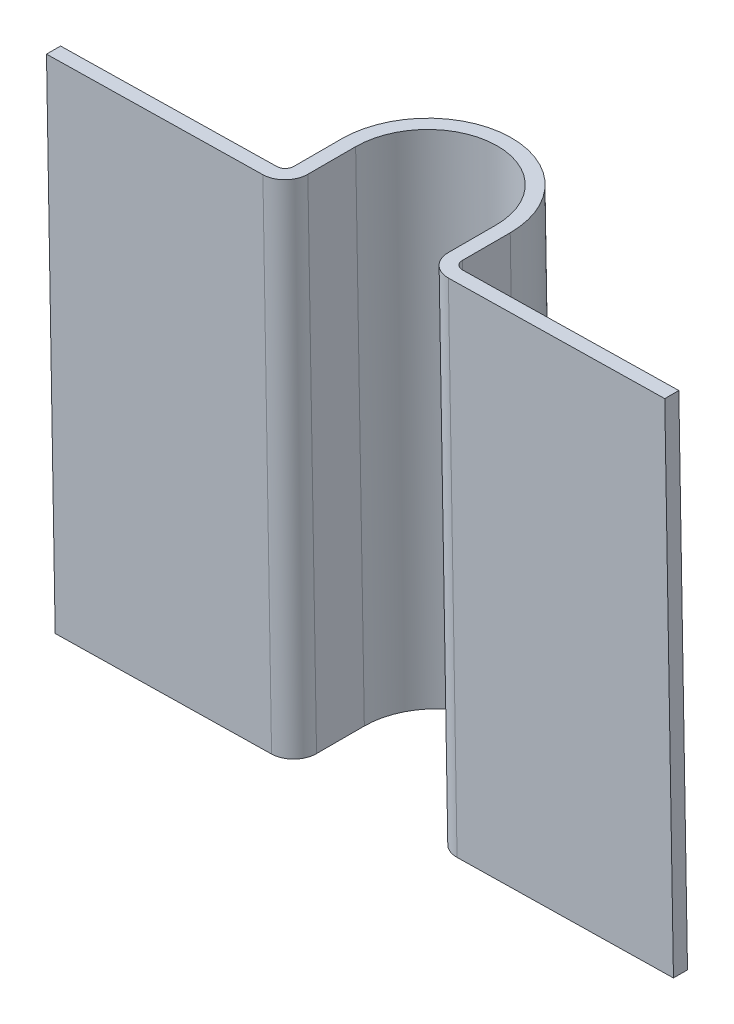
ISO-10303-21;
HEADER;
FILE_DESCRIPTION(('STEP AP214'),'2;1');
FILE_NAME('part.step','',(''),(''),'','','');
FILE_SCHEMA(('AUTOMOTIVE_DESIGN { 1 0 10303 214 1 1 1 1 }'));
ENDSEC;
DATA;
#1=APPLICATION_CONTEXT('core data for automotive mechanical design processes');
#2=APPLICATION_PROTOCOL_DEFINITION('international standard','automotive_design',2000,#1);
#3=PRODUCT_CONTEXT('',#1,'mechanical');
#4=PRODUCT('Part','Part','',(#3));
#5=PRODUCT_RELATED_PRODUCT_CATEGORY('part','',(#4));
#6=PRODUCT_DEFINITION_FORMATION('','',#4);
#7=PRODUCT_DEFINITION_CONTEXT('part definition',#1,'design');
#8=PRODUCT_DEFINITION('design','',#6,#7);
#9=PRODUCT_DEFINITION_SHAPE('','',#8);
#10=(LENGTH_UNIT() NAMED_UNIT(*) SI_UNIT(.MILLI.,.METRE.));
#11=(NAMED_UNIT(*) PLANE_ANGLE_UNIT() SI_UNIT($,.RADIAN.));
#12=(NAMED_UNIT(*) SI_UNIT($,.STERADIAN.) SOLID_ANGLE_UNIT());
#13=UNCERTAINTY_MEASURE_WITH_UNIT(LENGTH_MEASURE(1.E-05),#10,'distance_accuracy_value','');
#14=(GEOMETRIC_REPRESENTATION_CONTEXT(3) GLOBAL_UNCERTAINTY_ASSIGNED_CONTEXT((#13)) GLOBAL_UNIT_ASSIGNED_CONTEXT((#10,
#11,#12)) REPRESENTATION_CONTEXT('',''));
#15=CARTESIAN_POINT('',(0.,0.,0.));
#16=DIRECTION('',(0.,0.,1.));
#17=DIRECTION('',(1.,0.,0.));
#18=AXIS2_PLACEMENT_3D('',#15,#16,#17);
#19=CARTESIAN_POINT('',(37.8131092721581,6.95546175920105,-0.2032));
#20=DIRECTION('',(-0.0174524064372838,0.999847695156391,0.));
#21=DIRECTION('',(-0.999847695156391,-0.0174524064372838,0.));
#22=AXIS2_PLACEMENT_3D('',#19,#20,#21);
#23=CYLINDRICAL_SURFACE('',#22,0.2032);
#24=CARTESIAN_POINT('',(37.8131092721581,6.95546175920105,-0.2032));
#25=DIRECTION('',(-0.0174524064372838,0.999847695156391,0.));
#26=DIRECTION('',(-0.999847695156391,-0.0174524064372838,0.));
#27=AXIS2_PLACEMENT_3D('',#24,#25,#26);
#28=CIRCLE('',#27,0.2032);
#29=CARTESIAN_POINT('',(37.8131092721581,6.95546175920105,0.));
#30=VERTEX_POINT('',#29);
#31=CARTESIAN_POINT('',(38.0162783238138,6.95900808818911,-0.2032));
#32=VERTEX_POINT('',#31);
#33=EDGE_CURVE('E317',#30,#32,#28,.T.);
#34=ORIENTED_EDGE('',*,*,#33,.T.);
#35=DIRECTION('',(0.0174524064372838,-0.999847695156391,0.));
#36=VECTOR('',#35,1.);
#37=CARTESIAN_POINT('',(38.0162783238138,6.95900808818911,-0.2032));
#38=LINE('',#37,#36);
#39=CARTESIAN_POINT('',(37.9378157949531,11.4541233560732,-0.2032));
#40=VERTEX_POINT('',#39);
#41=EDGE_CURVE('E296',#32,#40,#38,.F.);
#42=ORIENTED_EDGE('',*,*,#41,.T.);
#43=CARTESIAN_POINT('',(37.7346467432973,11.4505770270851,-0.2032));
#44=DIRECTION('',(-0.0174524064372838,0.999847695156391,0.));
#45=DIRECTION('',(-0.999847695156391,-0.0174524064372838,0.));
#46=AXIS2_PLACEMENT_3D('',#43,#44,#45);
#47=CIRCLE('',#46,0.2032);
#48=CARTESIAN_POINT('',(37.7346467432973,11.4505770270851,0.));
#49=VERTEX_POINT('',#48);
#50=EDGE_CURVE('E20',#40,#49,#47,.F.);
#51=ORIENTED_EDGE('',*,*,#50,.T.);
#52=DIRECTION('',(0.0174524064372732,-0.999847695156391,0.));
#53=VECTOR('',#52,1.);
#54=CARTESIAN_POINT('',(37.7346467432974,11.4505770270851,0.));
#55=LINE('',#54,#53);
#56=EDGE_CURVE('E286',#49,#30,#55,.T.);
#57=ORIENTED_EDGE('',*,*,#56,.T.);
#58=EDGE_LOOP('',(#34,#42,#51,#57));
#59=FACE_BOUND('',#58,.T.);
#60=ADVANCED_FACE('F17',(#59),#23,.T.);
#61=CARTESIAN_POINT('',(35.8576071499712,6.92132834269101,-0.127));
#62=DIRECTION('',(-0.999847695156391,-0.0174524064372838,0.));
#63=DIRECTION('',(0.0174524064372838,-0.999847695156391,0.));
#64=AXIS2_PLACEMENT_3D('',#61,#62,#63);
#65=PLANE('',#64);
#66=DIRECTION('',(0.,0.,1.));
#67=VECTOR('',#66,1.);
#68=CARTESIAN_POINT('',(35.8576071499712,6.92132834269101,-0.127));
#69=LINE('',#68,#67);
#70=CARTESIAN_POINT('',(35.8576071499712,6.92132834269101,-0.127));
#71=VERTEX_POINT('',#70);
#72=CARTESIAN_POINT('',(35.8576071499712,6.92132834269101,0.));
#73=VERTEX_POINT('',#72);
#74=EDGE_CURVE('E308',#71,#73,#69,.T.);
#75=ORIENTED_EDGE('',*,*,#74,.T.);
#76=DIRECTION('',(-0.0174524064372871,0.999847695156391,0.));
#77=VECTOR('',#76,1.);
#78=CARTESIAN_POINT('',(35.8576071499712,6.92132834269101,0.));
#79=LINE('',#78,#77);
#80=CARTESIAN_POINT('',(35.7791446211105,11.4164436105751,0.));
#81=VERTEX_POINT('',#80);
#82=EDGE_CURVE('E283',#73,#81,#79,.T.);
#83=ORIENTED_EDGE('',*,*,#82,.T.);
#84=DIRECTION('',(0.,0.,1.));
#85=VECTOR('',#84,1.);
#86=CARTESIAN_POINT('',(35.7791446211105,11.4164436105751,-0.127));
#87=LINE('',#86,#85);
#88=CARTESIAN_POINT('',(35.7791446211105,11.4164436105751,-0.127));
#89=VERTEX_POINT('',#88);
#90=EDGE_CURVE('E136',#81,#89,#87,.F.);
#91=ORIENTED_EDGE('',*,*,#90,.T.);
#92=DIRECTION('',(-0.0174524064372871,0.999847695156391,0.));
#93=VECTOR('',#92,1.);
#94=CARTESIAN_POINT('',(35.8576071499712,6.92132834269101,-0.127000000000001));
#95=LINE('',#94,#93);
#96=EDGE_CURVE('E180',#71,#89,#95,.T.);
#97=ORIENTED_EDGE('',*,*,#96,.F.);
#98=EDGE_LOOP('',(#75,#83,#91,#97));
#99=FACE_BOUND('',#98,.T.);
#100=ADVANCED_FACE('F524',(#99),#65,.T.);
#101=CARTESIAN_POINT('',(41.4447560705051,7.01885238986255,0.));
#102=DIRECTION('',(0.999847695156391,0.0174524064372838,0.));
#103=DIRECTION('',(-0.0174524064372838,0.999847695156391,0.));
#104=AXIS2_PLACEMENT_3D('',#101,#102,#103);
#105=PLANE('',#104);
#106=DIRECTION('',(0.,0.,1.));
#107=VECTOR('',#106,1.);
#108=CARTESIAN_POINT('',(41.4447560705051,7.01885238986255,0.));
#109=LINE('',#108,#107);
#110=CARTESIAN_POINT('',(41.4447560705051,7.01885238986255,0.));
#111=VERTEX_POINT('',#110);
#112=CARTESIAN_POINT('',(41.4447560705051,7.01885238986255,-0.127000000000001));
#113=VERTEX_POINT('',#112);
#114=EDGE_CURVE('E157',#111,#113,#109,.F.);
#115=ORIENTED_EDGE('',*,*,#114,.T.);
#116=DIRECTION('',(0.0174524064372747,-0.999847695156391,0.));
#117=VECTOR('',#116,1.);
#118=CARTESIAN_POINT('',(41.3662935416444,11.5139676577467,-0.127000000000001));
#119=LINE('',#118,#117);
#120=CARTESIAN_POINT('',(41.3662935416444,11.5139676577467,-0.127000000000001));
#121=VERTEX_POINT('',#120);
#122=EDGE_CURVE('E160',#121,#113,#119,.T.);
#123=ORIENTED_EDGE('',*,*,#122,.F.);
#124=DIRECTION('',(0.,0.,1.));
#125=VECTOR('',#124,1.);
#126=CARTESIAN_POINT('',(41.3662935416444,11.5139676577467,0.));
#127=LINE('',#126,#125);
#128=CARTESIAN_POINT('',(41.3662935416444,11.5139676577467,0.));
#129=VERTEX_POINT('',#128);
#130=EDGE_CURVE('E169',#121,#129,#127,.T.);
#131=ORIENTED_EDGE('',*,*,#130,.T.);
#132=DIRECTION('',(0.0174524064372747,-0.999847695156391,0.));
#133=VECTOR('',#132,1.);
#134=CARTESIAN_POINT('',(41.3662935416444,11.5139676577467,0.));
#135=LINE('',#134,#133);
#136=EDGE_CURVE('E163',#129,#111,#135,.T.);
#137=ORIENTED_EDGE('',*,*,#136,.T.);
#138=EDGE_LOOP('',(#115,#123,#131,#137));
#139=FACE_BOUND('',#138,.T.);
#140=ADVANCED_FACE('F159',(#139),#105,.T.);
#141=CARTESIAN_POINT('',(39.4892539483183,6.98471897335251,-0.2032));
#142=DIRECTION('',(-0.0174524064372838,0.999847695156391,0.));
#143=DIRECTION('',(-0.999847695156391,-0.0174524064372838,0.));
#144=AXIS2_PLACEMENT_3D('',#141,#142,#143);
#145=CYLINDRICAL_SURFACE('',#144,0.2032);
#146=CARTESIAN_POINT('',(39.4892539483183,6.98471897335252,-0.2032));
#147=DIRECTION('',(-0.0174524064372838,0.999847695156391,0.));
#148=DIRECTION('',(-0.999847695156391,-0.0174524064372838,0.));
#149=AXIS2_PLACEMENT_3D('',#146,#147,#148);
#150=CIRCLE('',#149,0.2032);
#151=CARTESIAN_POINT('',(39.2860848966625,6.98117264436446,-0.2032));
#152=VERTEX_POINT('',#151);
#153=CARTESIAN_POINT('',(39.4892539483183,6.98471897335252,0.));
#154=VERTEX_POINT('',#153);
#155=EDGE_CURVE('E325',#152,#154,#150,.T.);
#156=ORIENTED_EDGE('',*,*,#155,.T.);
#157=DIRECTION('',(-0.017452406437287,0.999847695156391,0.));
#158=VECTOR('',#157,1.);
#159=CARTESIAN_POINT('',(39.4892539483183,6.98471897335251,0.));
#160=LINE('',#159,#158);
#161=CARTESIAN_POINT('',(39.4107914194575,11.4798342412366,0.));
#162=VERTEX_POINT('',#161);
#163=EDGE_CURVE('E261',#154,#162,#160,.T.);
#164=ORIENTED_EDGE('',*,*,#163,.T.);
#165=CARTESIAN_POINT('',(39.4107914194575,11.4798342412366,-0.2032));
#166=DIRECTION('',(-0.0174524064372838,0.999847695156391,0.));
#167=DIRECTION('',(-0.999847695156391,-0.0174524064372838,0.));
#168=AXIS2_PLACEMENT_3D('',#165,#166,#167);
#169=CIRCLE('',#168,0.2032);
#170=CARTESIAN_POINT('',(39.2076223678017,11.4762879122486,-0.2032));
#171=VERTEX_POINT('',#170);
#172=EDGE_CURVE('E168',#162,#171,#169,.F.);
#173=ORIENTED_EDGE('',*,*,#172,.T.);
#174=DIRECTION('',(-0.0174524064372838,0.999847695156391,0.));
#175=VECTOR('',#174,1.);
#176=CARTESIAN_POINT('',(39.2860848966625,6.98117264436446,-0.2032));
#177=LINE('',#176,#175);
#178=EDGE_CURVE('E306',#171,#152,#177,.F.);
#179=ORIENTED_EDGE('',*,*,#178,.T.);
#180=EDGE_LOOP('',(#156,#164,#173,#179));
#181=FACE_BOUND('',#180,.T.);
#182=ADVANCED_FACE('F505',(#181),#145,.T.);
#183=CARTESIAN_POINT('',(39.2860848966625,6.98117264436446,-0.2032));
#184=DIRECTION('',(0.999847695156391,0.0174524064372838,0.));
#185=DIRECTION('',(-0.0174524064372838,0.999847695156391,0.));
#186=AXIS2_PLACEMENT_3D('',#183,#184,#185);
#187=PLANE('',#186);
#188=DIRECTION('',(-0.0174524064372838,0.999847695156391,0.));
#189=VECTOR('',#188,1.);
#190=CARTESIAN_POINT('',(39.2860848966625,6.98117264436446,-0.635));
#191=LINE('',#190,#189);
#192=CARTESIAN_POINT('',(39.2076223678017,11.4762879122486,-0.635));
#193=VERTEX_POINT('',#192);
#194=CARTESIAN_POINT('',(39.2860848966625,6.98117264436446,-0.635));
#195=VERTEX_POINT('',#194);
#196=EDGE_CURVE('E256',#193,#195,#191,.F.);
#197=ORIENTED_EDGE('',*,*,#196,.T.);
#198=DIRECTION('',(0.,0.,1.));
#199=VECTOR('',#198,1.);
#200=CARTESIAN_POINT('',(39.2860848966625,6.98117264436446,-0.2032));
#201=LINE('',#200,#199);
#202=EDGE_CURVE('E303',#152,#195,#201,.F.);
#203=ORIENTED_EDGE('',*,*,#202,.F.);
#204=ORIENTED_EDGE('',*,*,#178,.F.);
#205=DIRECTION('',(0.,0.,1.));
#206=VECTOR('',#205,1.);
#207=CARTESIAN_POINT('',(39.2076223678017,11.4762879122486,-0.2032));
#208=LINE('',#207,#206);
#209=EDGE_CURVE('E297',#193,#171,#208,.T.);
#210=ORIENTED_EDGE('',*,*,#209,.F.);
#211=EDGE_LOOP('',(#197,#203,#204,#210));
#212=FACE_BOUND('',#211,.T.);
#213=ADVANCED_FACE('F495',(#212),#187,.F.);
#214=CARTESIAN_POINT('',(38.0162783238138,6.95900808818911,-0.2032));
#215=DIRECTION('',(-0.999847695156391,-0.0174524064372838,0.));
#216=DIRECTION('',(0.0174524064372838,-0.999847695156391,0.));
#217=AXIS2_PLACEMENT_3D('',#214,#215,#216);
#218=PLANE('',#217);
#219=ORIENTED_EDGE('',*,*,#41,.F.);
#220=DIRECTION('',(0.,0.,1.));
#221=VECTOR('',#220,1.);
#222=CARTESIAN_POINT('',(38.0162783238138,6.95900808818911,-0.2032));
#223=LINE('',#222,#221);
#224=CARTESIAN_POINT('',(38.0162783238139,6.95900808818911,-0.635));
#225=VERTEX_POINT('',#224);
#226=EDGE_CURVE('E293',#225,#32,#223,.T.);
#227=ORIENTED_EDGE('',*,*,#226,.F.);
#228=DIRECTION('',(-0.0174524064372838,0.999847695156391,0.));
#229=VECTOR('',#228,1.);
#230=CARTESIAN_POINT('',(38.0162783238139,6.95900808818911,-0.635));
#231=LINE('',#230,#229);
#232=CARTESIAN_POINT('',(37.9378157949531,11.4541233560732,-0.635));
#233=VERTEX_POINT('',#232);
#234=EDGE_CURVE('E260',#225,#233,#231,.T.);
#235=ORIENTED_EDGE('',*,*,#234,.T.);
#236=DIRECTION('',(0.,0.,1.));
#237=VECTOR('',#236,1.);
#238=CARTESIAN_POINT('',(37.9378157949531,11.4541233560732,-0.2032));
#239=LINE('',#238,#237);
#240=EDGE_CURVE('E298',#40,#233,#239,.F.);
#241=ORIENTED_EDGE('',*,*,#240,.F.);
#242=EDGE_LOOP('',(#219,#227,#235,#241));
#243=FACE_BOUND('',#242,.T.);
#244=ADVANCED_FACE('F485',(#243),#218,.F.);
#245=CARTESIAN_POINT('',(39.4892539483183,6.98471897335251,-0.2032));
#246=DIRECTION('',(-0.0174524064372838,0.999847695156391,0.));
#247=DIRECTION('',(-0.999847695156391,-0.0174524064372838,0.));
#248=AXIS2_PLACEMENT_3D('',#245,#246,#247);
#249=CYLINDRICAL_SURFACE('',#248,0.0762);
#250=DIRECTION('',(-0.017452406437287,0.999847695156391,0.));
#251=VECTOR('',#250,1.);
#252=CARTESIAN_POINT('',(39.4892539483183,6.98471897335251,-0.127000000000001));
#253=LINE('',#252,#251);
#254=CARTESIAN_POINT('',(39.4892539483183,6.98471897335251,-0.127000000000001));
#255=VERTEX_POINT('',#254);
#256=CARTESIAN_POINT('',(39.4107914194575,11.4798342412366,-0.127));
#257=VERTEX_POINT('',#256);
#258=EDGE_CURVE('E179',#255,#257,#253,.T.);
#259=ORIENTED_EDGE('',*,*,#258,.F.);
#260=CARTESIAN_POINT('',(39.4892539483183,6.98471897335251,-0.2032));
#261=DIRECTION('',(-0.0174524064372838,0.999847695156391,0.));
#262=DIRECTION('',(-0.999847695156391,-0.0174524064372838,0.));
#263=AXIS2_PLACEMENT_3D('',#260,#261,#262);
#264=CIRCLE('',#263,0.0762);
#265=CARTESIAN_POINT('',(39.4130655539473,6.98338909998199,-0.2032));
#266=VERTEX_POINT('',#265);
#267=EDGE_CURVE('E184',#266,#255,#264,.T.);
#268=ORIENTED_EDGE('',*,*,#267,.F.);
#269=DIRECTION('',(-0.0174524064372838,0.999847695156391,0.));
#270=VECTOR('',#269,1.);
#271=CARTESIAN_POINT('',(39.4130655539473,6.98338909998199,-0.2032));
#272=LINE('',#271,#270);
#273=CARTESIAN_POINT('',(39.3346030250866,11.4785043678661,-0.2032));
#274=VERTEX_POINT('',#273);
#275=EDGE_CURVE('E212',#274,#266,#272,.F.);
#276=ORIENTED_EDGE('',*,*,#275,.F.);
#277=CARTESIAN_POINT('',(39.4107914194575,11.4798342412366,-0.2032));
#278=DIRECTION('',(-0.0174524064372838,0.999847695156391,0.));
#279=DIRECTION('',(-0.999847695156391,-0.0174524064372838,0.));
#280=AXIS2_PLACEMENT_3D('',#277,#278,#279);
#281=CIRCLE('',#280,0.0762);
#282=EDGE_CURVE('E242',#274,#257,#281,.T.);
#283=ORIENTED_EDGE('',*,*,#282,.T.);
#284=EDGE_LOOP('',(#259,#268,#276,#283));
#285=FACE_BOUND('',#284,.T.);
#286=ADVANCED_FACE('F476',(#285),#249,.F.);
#287=CARTESIAN_POINT('',(37.8131092721581,6.95546175920105,0.));
#288=DIRECTION('',(0.,0.,-1.));
#289=DIRECTION('',(-1.,0.,0.));
#290=AXIS2_PLACEMENT_3D('',#287,#288,#289);
#291=PLANE('',#290);
#292=ORIENTED_EDGE('',*,*,#82,.F.);
#293=DIRECTION('',(0.999847695156391,0.0174524064372838,0.));
#294=VECTOR('',#293,1.);
#295=CARTESIAN_POINT('',(37.8131092721581,6.95546175920105,0.));
#296=LINE('',#295,#294);
#297=EDGE_CURVE('E206',#30,#73,#296,.F.);
#298=ORIENTED_EDGE('',*,*,#297,.F.);
#299=ORIENTED_EDGE('',*,*,#56,.F.);
#300=DIRECTION('',(0.999847695156391,0.0174524064372838,0.));
#301=VECTOR('',#300,1.);
#302=CARTESIAN_POINT('',(37.7346467432974,11.4505770270851,0.));
#303=LINE('',#302,#301);
#304=EDGE_CURVE('E228',#49,#81,#303,.F.);
#305=ORIENTED_EDGE('',*,*,#304,.T.);
#306=EDGE_LOOP('',(#292,#298,#299,#305));
#307=FACE_BOUND('',#306,.T.);
#308=ADVANCED_FACE('F355',(#307),#291,.F.);
#309=CARTESIAN_POINT('',(37.8131092721581,6.95546175920105,-0.127000000000001));
#310=DIRECTION('',(0.,0.,-1.));
#311=DIRECTION('',(-1.,0.,0.));
#312=AXIS2_PLACEMENT_3D('',#309,#310,#311);
#313=PLANE('',#312);
#314=DIRECTION('',(0.999847695156391,0.0174524064372838,0.));
#315=VECTOR('',#314,1.);
#316=CARTESIAN_POINT('',(37.8131092721581,6.95546175920105,-0.127));
#317=LINE('',#316,#315);
#318=CARTESIAN_POINT('',(37.8131092721581,6.95546175920105,-0.127));
#319=VERTEX_POINT('',#318);
#320=EDGE_CURVE('E202',#71,#319,#317,.T.);
#321=ORIENTED_EDGE('',*,*,#320,.F.);
#322=ORIENTED_EDGE('',*,*,#96,.T.);
#323=DIRECTION('',(0.999847695156391,0.0174524064372838,0.));
#324=VECTOR('',#323,1.);
#325=CARTESIAN_POINT('',(37.7346467432974,11.4505770270851,-0.127));
#326=LINE('',#325,#324);
#327=CARTESIAN_POINT('',(37.7346467432973,11.4505770270851,-0.127));
#328=VERTEX_POINT('',#327);
#329=EDGE_CURVE('E245',#89,#328,#326,.T.);
#330=ORIENTED_EDGE('',*,*,#329,.T.);
#331=DIRECTION('',(-0.0174524064372838,0.999847695156391,0.));
#332=VECTOR('',#331,1.);
#333=CARTESIAN_POINT('',(37.8131092721581,6.95546175920105,-0.127));
#334=LINE('',#333,#332);
#335=EDGE_CURVE('E248',#328,#319,#334,.F.);
#336=ORIENTED_EDGE('',*,*,#335,.T.);
#337=EDGE_LOOP('',(#321,#322,#330,#336));
#338=FACE_BOUND('',#337,.T.);
#339=ADVANCED_FACE('F458',(#338),#313,.T.);
#340=CARTESIAN_POINT('',(41.4447560705051,7.01885238986255,-0.127000000000001));
#341=DIRECTION('',(0.,0.,-1.));
#342=DIRECTION('',(0.,1.,0.));
#343=AXIS2_PLACEMENT_3D('',#340,#341,#342);
#344=PLANE('',#343);
#345=DIRECTION('',(0.999847695156391,0.0174524064372838,0.));
#346=VECTOR('',#345,1.);
#347=CARTESIAN_POINT('',(37.8131092721581,6.95546175920105,-0.127));
#348=LINE('',#347,#346);
#349=EDGE_CURVE('E175',#255,#113,#348,.T.);
#350=ORIENTED_EDGE('',*,*,#349,.F.);
#351=ORIENTED_EDGE('',*,*,#258,.T.);
#352=DIRECTION('',(0.999847695156391,0.0174524064372838,0.));
#353=VECTOR('',#352,1.);
#354=CARTESIAN_POINT('',(37.7346467432974,11.4505770270851,-0.127));
#355=LINE('',#354,#353);
#356=EDGE_CURVE('E177',#257,#121,#355,.T.);
#357=ORIENTED_EDGE('',*,*,#356,.T.);
#358=ORIENTED_EDGE('',*,*,#122,.T.);
#359=EDGE_LOOP('',(#350,#351,#357,#358));
#360=FACE_BOUND('',#359,.T.);
#361=ADVANCED_FACE('F173',(#360),#344,.T.);
#362=CARTESIAN_POINT('',(41.4447560705051,7.01885238986255,0.));
#363=DIRECTION('',(0.,0.,-1.));
#364=DIRECTION('',(0.,1.,0.));
#365=AXIS2_PLACEMENT_3D('',#362,#363,#364);
#366=PLANE('',#365);
#367=ORIENTED_EDGE('',*,*,#163,.F.);
#368=DIRECTION('',(0.999847695156391,0.0174524064372838,0.));
#369=VECTOR('',#368,1.);
#370=CARTESIAN_POINT('',(37.8131092721581,6.95546175920105,0.));
#371=LINE('',#370,#369);
#372=EDGE_CURVE('E187',#111,#154,#371,.F.);
#373=ORIENTED_EDGE('',*,*,#372,.F.);
#374=ORIENTED_EDGE('',*,*,#136,.F.);
#375=DIRECTION('',(0.999847695156391,0.0174524064372838,0.));
#376=VECTOR('',#375,1.);
#377=CARTESIAN_POINT('',(37.7346467432974,11.4505770270851,0.));
#378=LINE('',#377,#376);
#379=EDGE_CURVE('E234',#129,#162,#378,.F.);
#380=ORIENTED_EDGE('',*,*,#379,.T.);
#381=EDGE_LOOP('',(#367,#373,#374,#380));
#382=FACE_BOUND('',#381,.T.);
#383=ADVANCED_FACE('F439',(#382),#366,.F.);
#384=CARTESIAN_POINT('',(38.6511816102382,6.97009036627678,-0.635));
#385=DIRECTION('',(-0.0174524064372838,0.999847695156391,0.));
#386=DIRECTION('',(-0.999847695156391,-0.0174524064372838,0.));
#387=AXIS2_PLACEMENT_3D('',#384,#385,#386);
#388=CYLINDRICAL_SURFACE('',#387,0.635);
#389=ORIENTED_EDGE('',*,*,#234,.F.);
#390=CARTESIAN_POINT('',(38.6511816102382,6.97009036627678,-0.635));
#391=DIRECTION('',(-0.0174524064372838,0.999847695156391,0.));
#392=DIRECTION('',(-0.999847695156391,-0.0174524064372838,0.));
#393=AXIS2_PLACEMENT_3D('',#390,#391,#392);
#394=CIRCLE('',#393,0.635);
#395=EDGE_CURVE('E192',#195,#225,#394,.T.);
#396=ORIENTED_EDGE('',*,*,#395,.F.);
#397=ORIENTED_EDGE('',*,*,#196,.F.);
#398=CARTESIAN_POINT('',(38.5727190813774,11.4652056341609,-0.635));
#399=DIRECTION('',(-0.0174524064372838,0.999847695156391,0.));
#400=DIRECTION('',(-0.999847695156391,-0.0174524064372838,0.));
#401=AXIS2_PLACEMENT_3D('',#398,#399,#400);
#402=CIRCLE('',#401,0.635);
#403=EDGE_CURVE('E231',#193,#233,#402,.T.);
#404=ORIENTED_EDGE('',*,*,#403,.T.);
#405=EDGE_LOOP('',(#389,#396,#397,#404));
#406=FACE_BOUND('',#405,.T.);
#407=ADVANCED_FACE('F368',(#406),#388,.F.);
#408=CARTESIAN_POINT('',(37.8131092721581,6.95546175920105,-0.2032));
#409=DIRECTION('',(-0.0174524064372838,0.999847695156391,0.));
#410=DIRECTION('',(-0.999847695156391,-0.0174524064372838,0.));
#411=AXIS2_PLACEMENT_3D('',#408,#409,#410);
#412=CYLINDRICAL_SURFACE('',#411,0.0762);
#413=DIRECTION('',(0.0174524064372838,-0.999847695156391,0.));
#414=VECTOR('',#413,1.);
#415=CARTESIAN_POINT('',(37.889297666529,6.95679163257157,-0.2032));
#416=LINE('',#415,#414);
#417=CARTESIAN_POINT('',(37.889297666529,6.95679163257157,-0.2032));
#418=VERTEX_POINT('',#417);
#419=CARTESIAN_POINT('',(37.8108351376683,11.4519069004557,-0.2032));
#420=VERTEX_POINT('',#419);
#421=EDGE_CURVE('E222',#418,#420,#416,.F.);
#422=ORIENTED_EDGE('',*,*,#421,.F.);
#423=CARTESIAN_POINT('',(37.8131092721581,6.95546175920105,-0.2032));
#424=DIRECTION('',(-0.0174524064372838,0.999847695156391,0.));
#425=DIRECTION('',(-0.999847695156391,-0.0174524064372838,0.));
#426=AXIS2_PLACEMENT_3D('',#423,#424,#425);
#427=CIRCLE('',#426,0.0762);
#428=EDGE_CURVE('E195',#319,#418,#427,.T.);
#429=ORIENTED_EDGE('',*,*,#428,.F.);
#430=ORIENTED_EDGE('',*,*,#335,.F.);
#431=CARTESIAN_POINT('',(37.7346467432973,11.4505770270852,-0.2032));
#432=DIRECTION('',(-0.0174524064372838,0.999847695156391,0.));
#433=DIRECTION('',(-0.999847695156391,-0.0174524064372838,0.));
#434=AXIS2_PLACEMENT_3D('',#431,#432,#433);
#435=CIRCLE('',#434,0.0762);
#436=EDGE_CURVE('E247',#328,#420,#435,.T.);
#437=ORIENTED_EDGE('',*,*,#436,.T.);
#438=EDGE_LOOP('',(#422,#429,#430,#437));
#439=FACE_BOUND('',#438,.T.);
#440=ADVANCED_FACE('F359',(#439),#412,.F.);
#441=CARTESIAN_POINT('',(37.7346467432974,11.4505770270851,-0.2032));
#442=DIRECTION('',(0.0174524064372838,-0.999847695156391,0.));
#443=DIRECTION('',(0.999847695156391,0.0174524064372838,0.));
#444=AXIS2_PLACEMENT_3D('',#441,#442,#443);
#445=PLANE('',#444);
#446=ORIENTED_EDGE('',*,*,#50,.F.);
#447=ORIENTED_EDGE('',*,*,#240,.T.);
#448=ORIENTED_EDGE('',*,*,#403,.F.);
#449=ORIENTED_EDGE('',*,*,#209,.T.);
#450=ORIENTED_EDGE('',*,*,#172,.F.);
#451=ORIENTED_EDGE('',*,*,#379,.F.);
#452=ORIENTED_EDGE('',*,*,#130,.F.);
#453=ORIENTED_EDGE('',*,*,#356,.F.);
#454=ORIENTED_EDGE('',*,*,#282,.F.);
#455=DIRECTION('',(0.,0.,1.));
#456=VECTOR('',#455,1.);
#457=CARTESIAN_POINT('',(39.3346030250866,11.4785043678661,-0.2032));
#458=LINE('',#457,#456);
#459=CARTESIAN_POINT('',(39.3346030250866,11.4785043678661,-0.635));
#460=VERTEX_POINT('',#459);
#461=EDGE_CURVE('E224',#460,#274,#458,.T.);
#462=ORIENTED_EDGE('',*,*,#461,.F.);
#463=CARTESIAN_POINT('',(38.5727190813774,11.4652056341609,-0.635));
#464=DIRECTION('',(-0.0174524064372838,0.999847695156391,0.));
#465=DIRECTION('',(-0.999847695156391,-0.0174524064372838,0.));
#466=AXIS2_PLACEMENT_3D('',#463,#464,#465);
#467=CIRCLE('',#466,0.762);
#468=CARTESIAN_POINT('',(37.8108351376682,11.4519069004557,-0.635));
#469=VERTEX_POINT('',#468);
#470=EDGE_CURVE('E218',#469,#460,#467,.F.);
#471=ORIENTED_EDGE('',*,*,#470,.F.);
#472=DIRECTION('',(0.,0.,1.));
#473=VECTOR('',#472,1.);
#474=CARTESIAN_POINT('',(37.8108351376683,11.4519069004557,-0.2032));
#475=LINE('',#474,#473);
#476=EDGE_CURVE('E223',#420,#469,#475,.F.);
#477=ORIENTED_EDGE('',*,*,#476,.F.);
#478=ORIENTED_EDGE('',*,*,#436,.F.);
#479=ORIENTED_EDGE('',*,*,#329,.F.);
#480=ORIENTED_EDGE('',*,*,#90,.F.);
#481=ORIENTED_EDGE('',*,*,#304,.F.);
#482=EDGE_LOOP('',(#446,#447,#448,#449,#450,#451,#452,#453,#454,#462,#471,#477,#478,#479,#480,#481));
#483=FACE_BOUND('',#482,.T.);
#484=ADVANCED_FACE('F356',(#483),#445,.F.);
#485=CARTESIAN_POINT('',(39.4130655539473,6.98338909998199,-0.2032));
#486=DIRECTION('',(0.999847695156391,0.0174524064372838,0.));
#487=DIRECTION('',(-0.0174524064372838,0.999847695156391,0.));
#488=AXIS2_PLACEMENT_3D('',#485,#486,#487);
#489=PLANE('',#488);
#490=DIRECTION('',(0.,0.,1.));
#491=VECTOR('',#490,1.);
#492=CARTESIAN_POINT('',(39.4130655539473,6.98338909998199,-0.2032));
#493=LINE('',#492,#491);
#494=CARTESIAN_POINT('',(39.4130655539473,6.98338909998199,-0.635));
#495=VERTEX_POINT('',#494);
#496=EDGE_CURVE('E188',#495,#266,#493,.T.);
#497=ORIENTED_EDGE('',*,*,#496,.F.);
#498=DIRECTION('',(-0.0174524064372838,0.999847695156391,0.));
#499=VECTOR('',#498,1.);
#500=CARTESIAN_POINT('',(39.4130655539473,6.98338909998199,-0.635));
#501=LINE('',#500,#499);
#502=EDGE_CURVE('E215',#460,#495,#501,.F.);
#503=ORIENTED_EDGE('',*,*,#502,.F.);
#504=ORIENTED_EDGE('',*,*,#461,.T.);
#505=ORIENTED_EDGE('',*,*,#275,.T.);
#506=EDGE_LOOP('',(#497,#503,#504,#505));
#507=FACE_BOUND('',#506,.T.);
#508=ADVANCED_FACE('F358',(#507),#489,.T.);
#509=CARTESIAN_POINT('',(37.8131092721581,6.95546175920105,-0.2032));
#510=DIRECTION('',(0.0174524064372838,-0.999847695156391,0.));
#511=DIRECTION('',(0.999847695156391,0.0174524064372838,0.));
#512=AXIS2_PLACEMENT_3D('',#509,#510,#511);
#513=PLANE('',#512);
#514=ORIENTED_EDGE('',*,*,#226,.T.);
#515=ORIENTED_EDGE('',*,*,#33,.F.);
#516=ORIENTED_EDGE('',*,*,#297,.T.);
#517=ORIENTED_EDGE('',*,*,#74,.F.);
#518=ORIENTED_EDGE('',*,*,#320,.T.);
#519=ORIENTED_EDGE('',*,*,#428,.T.);
#520=DIRECTION('',(0.,0.,1.));
#521=VECTOR('',#520,1.);
#522=CARTESIAN_POINT('',(37.889297666529,6.95679163257157,-0.2032));
#523=LINE('',#522,#521);
#524=CARTESIAN_POINT('',(37.889297666529,6.95679163257157,-0.635));
#525=VERTEX_POINT('',#524);
#526=EDGE_CURVE('E40',#525,#418,#523,.T.);
#527=ORIENTED_EDGE('',*,*,#526,.F.);
#528=CARTESIAN_POINT('',(38.6511816102382,6.97009036627678,-0.635));
#529=DIRECTION('',(-0.0174524064372838,0.999847695156391,0.));
#530=DIRECTION('',(-0.999847695156391,-0.0174524064372838,0.));
#531=AXIS2_PLACEMENT_3D('',#528,#529,#530);
#532=CIRCLE('',#531,0.762);
#533=EDGE_CURVE('E27',#495,#525,#532,.T.);
#534=ORIENTED_EDGE('',*,*,#533,.F.);
#535=ORIENTED_EDGE('',*,*,#496,.T.);
#536=ORIENTED_EDGE('',*,*,#267,.T.);
#537=ORIENTED_EDGE('',*,*,#349,.T.);
#538=ORIENTED_EDGE('',*,*,#114,.F.);
#539=ORIENTED_EDGE('',*,*,#372,.T.);
#540=ORIENTED_EDGE('',*,*,#155,.F.);
#541=ORIENTED_EDGE('',*,*,#202,.T.);
#542=ORIENTED_EDGE('',*,*,#395,.T.);
#543=EDGE_LOOP('',(#514,#515,#516,#517,#518,#519,#527,#534,#535,#536,#537,#538,#539,#540,#541,#542));
#544=FACE_BOUND('',#543,.T.);
#545=ADVANCED_FACE('F182',(#544),#513,.T.);
#546=CARTESIAN_POINT('',(37.889297666529,6.95679163257157,-0.2032));
#547=DIRECTION('',(-0.999847695156391,-0.0174524064372838,0.));
#548=DIRECTION('',(0.0174524064372838,-0.999847695156391,0.));
#549=AXIS2_PLACEMENT_3D('',#546,#547,#548);
#550=PLANE('',#549);
#551=ORIENTED_EDGE('',*,*,#526,.T.);
#552=ORIENTED_EDGE('',*,*,#421,.T.);
#553=ORIENTED_EDGE('',*,*,#476,.T.);
#554=DIRECTION('',(-0.0174524064372838,0.999847695156391,0.));
#555=VECTOR('',#554,1.);
#556=CARTESIAN_POINT('',(37.889297666529,6.95679163257157,-0.635));
#557=LINE('',#556,#555);
#558=EDGE_CURVE('E11',#525,#469,#557,.T.);
#559=ORIENTED_EDGE('',*,*,#558,.F.);
#560=EDGE_LOOP('',(#551,#552,#553,#559));
#561=FACE_BOUND('',#560,.T.);
#562=ADVANCED_FACE('F373',(#561),#550,.T.);
#563=CARTESIAN_POINT('',(38.6511816102382,6.97009036627678,-0.635));
#564=DIRECTION('',(-0.0174524064372838,0.999847695156391,0.));
#565=DIRECTION('',(-0.999847695156391,-0.0174524064372838,0.));
#566=AXIS2_PLACEMENT_3D('',#563,#564,#565);
#567=CYLINDRICAL_SURFACE('',#566,0.762);
#568=ORIENTED_EDGE('',*,*,#533,.T.);
#569=ORIENTED_EDGE('',*,*,#558,.T.);
#570=ORIENTED_EDGE('',*,*,#470,.T.);
#571=ORIENTED_EDGE('',*,*,#502,.T.);
#572=EDGE_LOOP('',(#568,#569,#570,#571));
#573=FACE_BOUND('',#572,.T.);
#574=ADVANCED_FACE('F371',(#573),#567,.T.);
#575=CLOSED_SHELL('',(#60,#100,#140,#182,#213,#244,#286,#308,#339,#361,#383,#407,#440,#484,#508,
#545,#562,#574));
#576=MANIFOLD_SOLID_BREP('B1',#575);
#577=ADVANCED_BREP_SHAPE_REPRESENTATION('',(#18,#576),#14);
#578=SHAPE_DEFINITION_REPRESENTATION(#9,#577);
ENDSEC;
END-ISO-10303-21;
